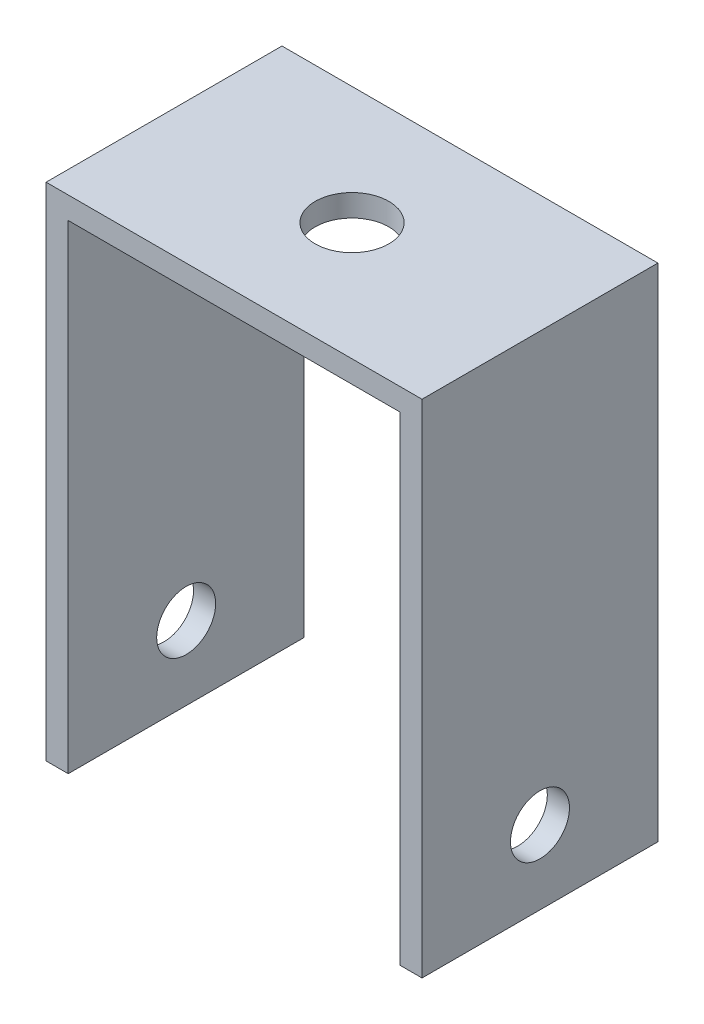
ISO-10303-21;
HEADER;
FILE_DESCRIPTION(('STEP AP214'),'2;1');
FILE_NAME('part.step','',(''),(''),'','','');
FILE_SCHEMA(('AUTOMOTIVE_DESIGN { 1 0 10303 214 1 1 1 1 }'));
ENDSEC;
DATA;
#1=APPLICATION_CONTEXT('core data for automotive mechanical design processes');
#2=APPLICATION_PROTOCOL_DEFINITION('international standard','automotive_design',2000,#1);
#3=PRODUCT_CONTEXT('',#1,'mechanical');
#4=PRODUCT('Part','Part','',(#3));
#5=PRODUCT_RELATED_PRODUCT_CATEGORY('part','',(#4));
#6=PRODUCT_DEFINITION_FORMATION('','',#4);
#7=PRODUCT_DEFINITION_CONTEXT('part definition',#1,'design');
#8=PRODUCT_DEFINITION('design','',#6,#7);
#9=PRODUCT_DEFINITION_SHAPE('','',#8);
#10=(LENGTH_UNIT() NAMED_UNIT(*) SI_UNIT(.MILLI.,.METRE.));
#11=(NAMED_UNIT(*) PLANE_ANGLE_UNIT() SI_UNIT($,.RADIAN.));
#12=(NAMED_UNIT(*) SI_UNIT($,.STERADIAN.) SOLID_ANGLE_UNIT());
#13=UNCERTAINTY_MEASURE_WITH_UNIT(LENGTH_MEASURE(1.E-05),#10,'distance_accuracy_value','');
#14=(GEOMETRIC_REPRESENTATION_CONTEXT(3) GLOBAL_UNCERTAINTY_ASSIGNED_CONTEXT((#13)) GLOBAL_UNIT_ASSIGNED_CONTEXT((#10,
#11,#12)) REPRESENTATION_CONTEXT('',''));
#15=CARTESIAN_POINT('',(0.,0.,0.));
#16=DIRECTION('',(0.,0.,1.));
#17=DIRECTION('',(1.,0.,0.));
#18=AXIS2_PLACEMENT_3D('',#15,#16,#17);
#19=CARTESIAN_POINT('',(-22.5,0.,16.));
#20=DIRECTION('',(0.,1.,0.));
#21=DIRECTION('',(-1.,0.,0.));
#22=AXIS2_PLACEMENT_3D('',#19,#20,#21);
#23=PLANE('',#22);
#24=DIRECTION('',(1.,0.,0.));
#25=VECTOR('',#24,1.);
#26=CARTESIAN_POINT('',(-22.5,0.,-16.));
#27=LINE('',#26,#25);
#28=CARTESIAN_POINT('',(-25.5,0.,-16.));
#29=VERTEX_POINT('',#28);
#30=CARTESIAN_POINT('',(-22.5,0.,-16.));
#31=VERTEX_POINT('',#30);
#32=EDGE_CURVE('E134',#29,#31,#27,.T.);
#33=ORIENTED_EDGE('',*,*,#32,.T.);
#34=DIRECTION('',(0.,0.,-1.));
#35=VECTOR('',#34,1.);
#36=CARTESIAN_POINT('',(-22.5,0.,16.));
#37=LINE('',#36,#35);
#38=CARTESIAN_POINT('',(-22.5,0.,16.));
#39=VERTEX_POINT('',#38);
#40=EDGE_CURVE('E11',#39,#31,#37,.T.);
#41=ORIENTED_EDGE('',*,*,#40,.F.);
#42=DIRECTION('',(1.,0.,0.));
#43=VECTOR('',#42,1.);
#44=CARTESIAN_POINT('',(-22.5,0.,16.));
#45=LINE('',#44,#43);
#46=CARTESIAN_POINT('',(-25.5,0.,16.));
#47=VERTEX_POINT('',#46);
#48=EDGE_CURVE('E149',#47,#39,#45,.T.);
#49=ORIENTED_EDGE('',*,*,#48,.F.);
#50=DIRECTION('',(0.,0.,-1.));
#51=VECTOR('',#50,1.);
#52=CARTESIAN_POINT('',(-25.5,0.,16.));
#53=LINE('',#52,#51);
#54=EDGE_CURVE('E130',#47,#29,#53,.T.);
#55=ORIENTED_EDGE('',*,*,#54,.T.);
#56=EDGE_LOOP('',(#33,#41,#49,#55));
#57=FACE_BOUND('',#56,.T.);
#58=ADVANCED_FACE('F38',(#57),#23,.F.);
#59=CARTESIAN_POINT('',(-22.5,0.,16.));
#60=DIRECTION('',(-1.,0.,0.));
#61=DIRECTION('',(0.,0.,1.));
#62=AXIS2_PLACEMENT_3D('',#59,#60,#61);
#63=PLANE('',#62);
#64=CARTESIAN_POINT('',(-22.5,10.,0.));
#65=DIRECTION('',(-1.,0.,0.));
#66=DIRECTION('',(0.,0.,1.));
#67=AXIS2_PLACEMENT_3D('',#64,#65,#66);
#68=CIRCLE('',#67,4.);
#69=CARTESIAN_POINT('',(-22.5,10.,4.));
#70=VERTEX_POINT('',#69);
#71=EDGE_CURVE('E138',#70,#70,#68,.T.);
#72=ORIENTED_EDGE('',*,*,#71,.T.);
#73=EDGE_LOOP('',(#72));
#74=FACE_BOUND('',#73,.T.);
#75=DIRECTION('',(0.,1.,0.));
#76=VECTOR('',#75,1.);
#77=CARTESIAN_POINT('',(-22.5,0.,-16.));
#78=LINE('',#77,#76);
#79=CARTESIAN_POINT('',(-22.5,65.,-16.));
#80=VERTEX_POINT('',#79);
#81=EDGE_CURVE('E137',#31,#80,#78,.T.);
#82=ORIENTED_EDGE('',*,*,#81,.T.);
#83=DIRECTION('',(0.,0.,-1.));
#84=VECTOR('',#83,1.);
#85=CARTESIAN_POINT('',(-22.5,65.,16.));
#86=LINE('',#85,#84);
#87=CARTESIAN_POINT('',(-22.5,65.,16.));
#88=VERTEX_POINT('',#87);
#89=EDGE_CURVE('E46',#88,#80,#86,.T.);
#90=ORIENTED_EDGE('',*,*,#89,.F.);
#91=DIRECTION('',(0.,1.,0.));
#92=VECTOR('',#91,1.);
#93=CARTESIAN_POINT('',(-22.5,0.,16.));
#94=LINE('',#93,#92);
#95=EDGE_CURVE('E97',#39,#88,#94,.T.);
#96=ORIENTED_EDGE('',*,*,#95,.F.);
#97=ORIENTED_EDGE('',*,*,#40,.T.);
#98=EDGE_LOOP('',(#82,#90,#96,#97));
#99=FACE_BOUND('',#98,.T.);
#100=ADVANCED_FACE('F215',(#74,#99),#63,.F.);
#101=CARTESIAN_POINT('',(-22.5,65.,16.));
#102=DIRECTION('',(0.,1.,0.));
#103=DIRECTION('',(0.,0.,1.));
#104=AXIS2_PLACEMENT_3D('',#101,#102,#103);
#105=PLANE('',#104);
#106=CARTESIAN_POINT('',(0.,65.,0.));
#107=DIRECTION('',(0.,1.,0.));
#108=DIRECTION('',(0.,0.,1.));
#109=AXIS2_PLACEMENT_3D('',#106,#107,#108);
#110=CIRCLE('',#109,5.);
#111=CARTESIAN_POINT('',(0.,65.,5.));
#112=VERTEX_POINT('',#111);
#113=EDGE_CURVE('E191',#112,#112,#110,.T.);
#114=ORIENTED_EDGE('',*,*,#113,.T.);
#115=EDGE_LOOP('',(#114));
#116=FACE_BOUND('',#115,.T.);
#117=DIRECTION('',(1.,0.,0.));
#118=VECTOR('',#117,1.);
#119=CARTESIAN_POINT('',(-22.5,65.,-16.));
#120=LINE('',#119,#118);
#121=CARTESIAN_POINT('',(22.5,65.,-16.));
#122=VERTEX_POINT('',#121);
#123=EDGE_CURVE('E140',#80,#122,#120,.T.);
#124=ORIENTED_EDGE('',*,*,#123,.T.);
#125=DIRECTION('',(0.,0.,-1.));
#126=VECTOR('',#125,1.);
#127=CARTESIAN_POINT('',(22.5,65.,16.));
#128=LINE('',#127,#126);
#129=CARTESIAN_POINT('',(22.5,65.,16.));
#130=VERTEX_POINT('',#129);
#131=EDGE_CURVE('E156',#130,#122,#128,.T.);
#132=ORIENTED_EDGE('',*,*,#131,.F.);
#133=DIRECTION('',(1.,0.,0.));
#134=VECTOR('',#133,1.);
#135=CARTESIAN_POINT('',(-22.5,65.,16.));
#136=LINE('',#135,#134);
#137=EDGE_CURVE('E164',#88,#130,#136,.T.);
#138=ORIENTED_EDGE('',*,*,#137,.F.);
#139=ORIENTED_EDGE('',*,*,#89,.T.);
#140=EDGE_LOOP('',(#124,#132,#138,#139));
#141=FACE_BOUND('',#140,.T.);
#142=ADVANCED_FACE('F162',(#116,#141),#105,.F.);
#143=CARTESIAN_POINT('',(22.5,0.,16.));
#144=DIRECTION('',(1.,0.,0.));
#145=DIRECTION('',(0.,0.,-1.));
#146=AXIS2_PLACEMENT_3D('',#143,#144,#145);
#147=PLANE('',#146);
#148=CARTESIAN_POINT('',(22.5,10.,0.));
#149=DIRECTION('',(1.,0.,0.));
#150=DIRECTION('',(0.,0.,-1.));
#151=AXIS2_PLACEMENT_3D('',#148,#149,#150);
#152=CIRCLE('',#151,4.);
#153=CARTESIAN_POINT('',(22.5,10.,-4.));
#154=VERTEX_POINT('',#153);
#155=EDGE_CURVE('E184',#154,#154,#152,.T.);
#156=ORIENTED_EDGE('',*,*,#155,.T.);
#157=EDGE_LOOP('',(#156));
#158=FACE_BOUND('',#157,.T.);
#159=DIRECTION('',(0.,-1.,0.));
#160=VECTOR('',#159,1.);
#161=CARTESIAN_POINT('',(22.5,0.,-16.));
#162=LINE('',#161,#160);
#163=CARTESIAN_POINT('',(22.5,0.,-16.));
#164=VERTEX_POINT('',#163);
#165=EDGE_CURVE('E142',#122,#164,#162,.T.);
#166=ORIENTED_EDGE('',*,*,#165,.T.);
#167=DIRECTION('',(0.,0.,-1.));
#168=VECTOR('',#167,1.);
#169=CARTESIAN_POINT('',(22.5,0.,16.));
#170=LINE('',#169,#168);
#171=CARTESIAN_POINT('',(22.5,0.,16.));
#172=VERTEX_POINT('',#171);
#173=EDGE_CURVE('E153',#172,#164,#170,.T.);
#174=ORIENTED_EDGE('',*,*,#173,.F.);
#175=DIRECTION('',(0.,-1.,0.));
#176=VECTOR('',#175,1.);
#177=CARTESIAN_POINT('',(22.5,0.,16.));
#178=LINE('',#177,#176);
#179=EDGE_CURVE('E176',#130,#172,#178,.T.);
#180=ORIENTED_EDGE('',*,*,#179,.F.);
#181=ORIENTED_EDGE('',*,*,#131,.T.);
#182=EDGE_LOOP('',(#166,#174,#180,#181));
#183=FACE_BOUND('',#182,.T.);
#184=ADVANCED_FACE('F172',(#158,#183),#147,.F.);
#185=CARTESIAN_POINT('',(22.5,0.,16.));
#186=DIRECTION('',(0.,1.,0.));
#187=DIRECTION('',(-1.,0.,0.));
#188=AXIS2_PLACEMENT_3D('',#185,#186,#187);
#189=PLANE('',#188);
#190=DIRECTION('',(1.,0.,0.));
#191=VECTOR('',#190,1.);
#192=CARTESIAN_POINT('',(22.5,0.,-16.));
#193=LINE('',#192,#191);
#194=CARTESIAN_POINT('',(25.5,0.,-16.));
#195=VERTEX_POINT('',#194);
#196=EDGE_CURVE('E144',#164,#195,#193,.T.);
#197=ORIENTED_EDGE('',*,*,#196,.T.);
#198=DIRECTION('',(0.,0.,-1.));
#199=VECTOR('',#198,1.);
#200=CARTESIAN_POINT('',(25.5,0.,16.));
#201=LINE('',#200,#199);
#202=CARTESIAN_POINT('',(25.5,0.,16.));
#203=VERTEX_POINT('',#202);
#204=EDGE_CURVE('E125',#203,#195,#201,.T.);
#205=ORIENTED_EDGE('',*,*,#204,.F.);
#206=DIRECTION('',(1.,0.,0.));
#207=VECTOR('',#206,1.);
#208=CARTESIAN_POINT('',(22.5,0.,16.));
#209=LINE('',#208,#207);
#210=EDGE_CURVE('E116',#172,#203,#209,.T.);
#211=ORIENTED_EDGE('',*,*,#210,.F.);
#212=ORIENTED_EDGE('',*,*,#173,.T.);
#213=EDGE_LOOP('',(#197,#205,#211,#212));
#214=FACE_BOUND('',#213,.T.);
#215=ADVANCED_FACE('F175',(#214),#189,.F.);
#216=CARTESIAN_POINT('',(25.5,0.,16.));
#217=DIRECTION('',(-1.,0.,0.));
#218=DIRECTION('',(0.,0.,1.));
#219=AXIS2_PLACEMENT_3D('',#216,#217,#218);
#220=PLANE('',#219);
#221=CARTESIAN_POINT('',(25.5,10.,0.));
#222=DIRECTION('',(1.,0.,0.));
#223=DIRECTION('',(0.,0.,-1.));
#224=AXIS2_PLACEMENT_3D('',#221,#222,#223);
#225=CIRCLE('',#224,4.);
#226=CARTESIAN_POINT('',(25.5,10.,-4.));
#227=VERTEX_POINT('',#226);
#228=EDGE_CURVE('E188',#227,#227,#225,.T.);
#229=ORIENTED_EDGE('',*,*,#228,.F.);
#230=EDGE_LOOP('',(#229));
#231=FACE_BOUND('',#230,.T.);
#232=DIRECTION('',(0.,1.,0.));
#233=VECTOR('',#232,1.);
#234=CARTESIAN_POINT('',(25.5,0.,-16.));
#235=LINE('',#234,#233);
#236=CARTESIAN_POINT('',(25.5,68.,-16.));
#237=VERTEX_POINT('',#236);
#238=EDGE_CURVE('E124',#195,#237,#235,.T.);
#239=ORIENTED_EDGE('',*,*,#238,.T.);
#240=DIRECTION('',(0.,0.,-1.));
#241=VECTOR('',#240,1.);
#242=CARTESIAN_POINT('',(25.5,68.,16.));
#243=LINE('',#242,#241);
#244=CARTESIAN_POINT('',(25.5,68.,16.));
#245=VERTEX_POINT('',#244);
#246=EDGE_CURVE('E121',#245,#237,#243,.T.);
#247=ORIENTED_EDGE('',*,*,#246,.F.);
#248=DIRECTION('',(0.,1.,0.));
#249=VECTOR('',#248,1.);
#250=CARTESIAN_POINT('',(25.5,0.,16.));
#251=LINE('',#250,#249);
#252=EDGE_CURVE('E110',#203,#245,#251,.T.);
#253=ORIENTED_EDGE('',*,*,#252,.F.);
#254=ORIENTED_EDGE('',*,*,#204,.T.);
#255=EDGE_LOOP('',(#239,#247,#253,#254));
#256=FACE_BOUND('',#255,.T.);
#257=ADVANCED_FACE('F122',(#231,#256),#220,.F.);
#258=CARTESIAN_POINT('',(-25.5,68.,16.));
#259=DIRECTION('',(0.,-1.,0.));
#260=DIRECTION('',(0.,0.,-1.));
#261=AXIS2_PLACEMENT_3D('',#258,#259,#260);
#262=PLANE('',#261);
#263=CARTESIAN_POINT('',(0.,68.,0.));
#264=DIRECTION('',(0.,1.,0.));
#265=DIRECTION('',(0.,0.,1.));
#266=AXIS2_PLACEMENT_3D('',#263,#264,#265);
#267=CIRCLE('',#266,5.);
#268=CARTESIAN_POINT('',(0.,68.,5.));
#269=VERTEX_POINT('',#268);
#270=EDGE_CURVE('E196',#269,#269,#267,.T.);
#271=ORIENTED_EDGE('',*,*,#270,.F.);
#272=EDGE_LOOP('',(#271));
#273=FACE_BOUND('',#272,.T.);
#274=DIRECTION('',(-1.,0.,0.));
#275=VECTOR('',#274,1.);
#276=CARTESIAN_POINT('',(-25.5,68.,-16.));
#277=LINE('',#276,#275);
#278=CARTESIAN_POINT('',(-25.5,68.,-16.));
#279=VERTEX_POINT('',#278);
#280=EDGE_CURVE('E83',#237,#279,#277,.T.);
#281=ORIENTED_EDGE('',*,*,#280,.T.);
#282=DIRECTION('',(0.,0.,-1.));
#283=VECTOR('',#282,1.);
#284=CARTESIAN_POINT('',(-25.5,68.,16.));
#285=LINE('',#284,#283);
#286=CARTESIAN_POINT('',(-25.5,68.,16.));
#287=VERTEX_POINT('',#286);
#288=EDGE_CURVE('E126',#287,#279,#285,.T.);
#289=ORIENTED_EDGE('',*,*,#288,.F.);
#290=DIRECTION('',(-1.,0.,0.));
#291=VECTOR('',#290,1.);
#292=CARTESIAN_POINT('',(-25.5,68.,16.));
#293=LINE('',#292,#291);
#294=EDGE_CURVE('E114',#245,#287,#293,.T.);
#295=ORIENTED_EDGE('',*,*,#294,.F.);
#296=ORIENTED_EDGE('',*,*,#246,.T.);
#297=EDGE_LOOP('',(#281,#289,#295,#296));
#298=FACE_BOUND('',#297,.T.);
#299=ADVANCED_FACE('F128',(#273,#298),#262,.F.);
#300=CARTESIAN_POINT('',(-25.5,0.,16.));
#301=DIRECTION('',(1.,0.,0.));
#302=DIRECTION('',(0.,0.,-1.));
#303=AXIS2_PLACEMENT_3D('',#300,#301,#302);
#304=PLANE('',#303);
#305=CARTESIAN_POINT('',(-25.5,10.,0.));
#306=DIRECTION('',(1.,0.,0.));
#307=DIRECTION('',(0.,0.,-1.));
#308=AXIS2_PLACEMENT_3D('',#305,#306,#307);
#309=CIRCLE('',#308,4.);
#310=CARTESIAN_POINT('',(-25.5,10.,-4.));
#311=VERTEX_POINT('',#310);
#312=EDGE_CURVE('E187',#311,#311,#309,.T.);
#313=ORIENTED_EDGE('',*,*,#312,.T.);
#314=EDGE_LOOP('',(#313));
#315=FACE_BOUND('',#314,.T.);
#316=DIRECTION('',(0.,-1.,0.));
#317=VECTOR('',#316,1.);
#318=CARTESIAN_POINT('',(-25.5,0.,-16.));
#319=LINE('',#318,#317);
#320=EDGE_CURVE('E89',#279,#29,#319,.T.);
#321=ORIENTED_EDGE('',*,*,#320,.T.);
#322=ORIENTED_EDGE('',*,*,#54,.F.);
#323=DIRECTION('',(0.,-1.,0.));
#324=VECTOR('',#323,1.);
#325=CARTESIAN_POINT('',(-25.5,0.,16.));
#326=LINE('',#325,#324);
#327=EDGE_CURVE('E54',#287,#47,#326,.T.);
#328=ORIENTED_EDGE('',*,*,#327,.F.);
#329=ORIENTED_EDGE('',*,*,#288,.T.);
#330=EDGE_LOOP('',(#321,#322,#328,#329));
#331=FACE_BOUND('',#330,.T.);
#332=ADVANCED_FACE('F204',(#315,#331),#304,.F.);
#333=CARTESIAN_POINT('',(0.,0.,16.));
#334=DIRECTION('',(0.,0.,-1.));
#335=DIRECTION('',(-1.,0.,0.));
#336=AXIS2_PLACEMENT_3D('',#333,#334,#335);
#337=PLANE('',#336);
#338=ORIENTED_EDGE('',*,*,#48,.T.);
#339=ORIENTED_EDGE('',*,*,#95,.T.);
#340=ORIENTED_EDGE('',*,*,#137,.T.);
#341=ORIENTED_EDGE('',*,*,#179,.T.);
#342=ORIENTED_EDGE('',*,*,#210,.T.);
#343=ORIENTED_EDGE('',*,*,#252,.T.);
#344=ORIENTED_EDGE('',*,*,#294,.T.);
#345=ORIENTED_EDGE('',*,*,#327,.T.);
#346=EDGE_LOOP('',(#338,#339,#340,#341,#342,#343,#344,#345));
#347=FACE_BOUND('',#346,.T.);
#348=ADVANCED_FACE('F112',(#347),#337,.F.);
#349=CARTESIAN_POINT('',(0.,0.,-16.));
#350=DIRECTION('',(0.,0.,-1.));
#351=DIRECTION('',(-1.,0.,0.));
#352=AXIS2_PLACEMENT_3D('',#349,#350,#351);
#353=PLANE('',#352);
#354=ORIENTED_EDGE('',*,*,#32,.F.);
#355=ORIENTED_EDGE('',*,*,#320,.F.);
#356=ORIENTED_EDGE('',*,*,#280,.F.);
#357=ORIENTED_EDGE('',*,*,#238,.F.);
#358=ORIENTED_EDGE('',*,*,#196,.F.);
#359=ORIENTED_EDGE('',*,*,#165,.F.);
#360=ORIENTED_EDGE('',*,*,#123,.F.);
#361=ORIENTED_EDGE('',*,*,#81,.F.);
#362=EDGE_LOOP('',(#354,#355,#356,#357,#358,#359,#360,#361));
#363=FACE_BOUND('',#362,.T.);
#364=ADVANCED_FACE('F168',(#363),#353,.T.);
#365=CARTESIAN_POINT('',(-25.5,10.,0.));
#366=DIRECTION('',(1.,0.,0.));
#367=DIRECTION('',(0.,0.,-1.));
#368=AXIS2_PLACEMENT_3D('',#365,#366,#367);
#369=CYLINDRICAL_SURFACE('',#368,4.);
#370=ORIENTED_EDGE('',*,*,#312,.F.);
#371=EDGE_LOOP('',(#370));
#372=FACE_BOUND('',#371,.T.);
#373=ORIENTED_EDGE('',*,*,#71,.F.);
#374=EDGE_LOOP('',(#373));
#375=FACE_BOUND('',#374,.T.);
#376=ADVANCED_FACE('F258',(#372,#375),#369,.F.);
#377=ORIENTED_EDGE('',*,*,#228,.T.);
#378=EDGE_LOOP('',(#377));
#379=FACE_BOUND('',#378,.T.);
#380=ORIENTED_EDGE('',*,*,#155,.F.);
#381=EDGE_LOOP('',(#380));
#382=FACE_BOUND('',#381,.T.);
#383=ADVANCED_FACE('F263',(#379,#382),#369,.F.);
#384=CARTESIAN_POINT('',(0.,36.,0.));
#385=DIRECTION('',(0.,1.,0.));
#386=DIRECTION('',(0.,0.,1.));
#387=AXIS2_PLACEMENT_3D('',#384,#385,#386);
#388=CYLINDRICAL_SURFACE('',#387,5.);
#389=ORIENTED_EDGE('',*,*,#270,.T.);
#390=EDGE_LOOP('',(#389));
#391=FACE_BOUND('',#390,.T.);
#392=ORIENTED_EDGE('',*,*,#113,.F.);
#393=EDGE_LOOP('',(#392));
#394=FACE_BOUND('',#393,.T.);
#395=ADVANCED_FACE('F200',(#391,#394),#388,.F.);
#396=CLOSED_SHELL('',(#58,#100,#142,#184,#215,#257,#299,#332,#348,#364,#376,#383,#395));
#397=MANIFOLD_SOLID_BREP('B2',#396);
#398=ADVANCED_BREP_SHAPE_REPRESENTATION('',(#18,#397),#14);
#399=SHAPE_DEFINITION_REPRESENTATION(#9,#398);
ENDSEC;
END-ISO-10303-21;
